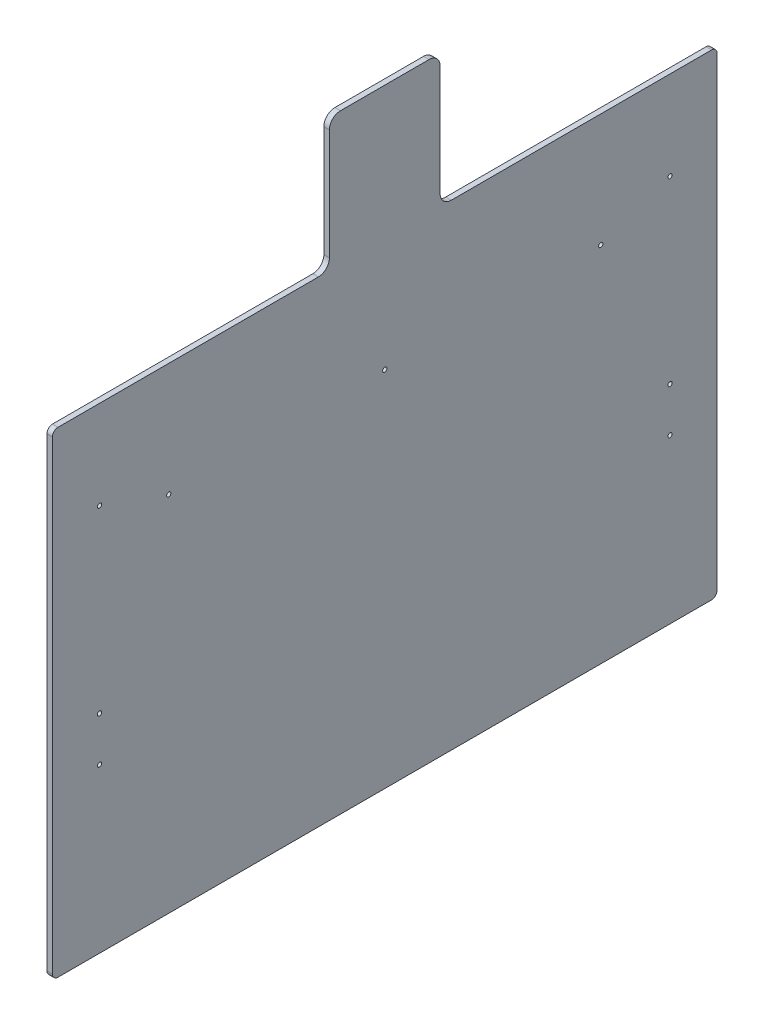
ISO-10303-21;
HEADER;
FILE_DESCRIPTION(('STEP AP214'),'2;1');
FILE_NAME('part.step','',(''),(''),'','','');
FILE_SCHEMA(('AUTOMOTIVE_DESIGN { 1 0 10303 214 1 1 1 1 }'));
ENDSEC;
DATA;
#1=APPLICATION_CONTEXT('core data for automotive mechanical design processes');
#2=APPLICATION_PROTOCOL_DEFINITION('international standard','automotive_design',2000,#1);
#3=PRODUCT_CONTEXT('',#1,'mechanical');
#4=PRODUCT('Part','Part','',(#3));
#5=PRODUCT_RELATED_PRODUCT_CATEGORY('part','',(#4));
#6=PRODUCT_DEFINITION_FORMATION('','',#4);
#7=PRODUCT_DEFINITION_CONTEXT('part definition',#1,'design');
#8=PRODUCT_DEFINITION('design','',#6,#7);
#9=PRODUCT_DEFINITION_SHAPE('','',#8);
#10=(LENGTH_UNIT() NAMED_UNIT(*) SI_UNIT(.MILLI.,.METRE.));
#11=(NAMED_UNIT(*) PLANE_ANGLE_UNIT() SI_UNIT($,.RADIAN.));
#12=(NAMED_UNIT(*) SI_UNIT($,.STERADIAN.) SOLID_ANGLE_UNIT());
#13=UNCERTAINTY_MEASURE_WITH_UNIT(LENGTH_MEASURE(1.E-05),#10,'distance_accuracy_value','');
#14=(GEOMETRIC_REPRESENTATION_CONTEXT(3) GLOBAL_UNCERTAINTY_ASSIGNED_CONTEXT((#13)) GLOBAL_UNIT_ASSIGNED_CONTEXT((#10,
#11,#12)) REPRESENTATION_CONTEXT('',''));
#15=CARTESIAN_POINT('',(0.,0.,0.));
#16=DIRECTION('',(0.,0.,1.));
#17=DIRECTION('',(1.,0.,0.));
#18=AXIS2_PLACEMENT_3D('',#15,#16,#17);
#19=CARTESIAN_POINT('',(6.35,6.35,-6.35));
#20=DIRECTION('',(-1.,0.,0.));
#21=DIRECTION('',(0.,0.,1.));
#22=AXIS2_PLACEMENT_3D('',#19,#20,#21);
#23=PLANE('',#22);
#24=CARTESIAN_POINT('',(6.35,415.925,-133.35));
#25=DIRECTION('',(1.,0.,0.));
#26=DIRECTION('',(0.,0.,-1.));
#27=AXIS2_PLACEMENT_3D('',#24,#25,#26);
#28=CIRCLE('',#27,2.45745000000002);
#29=CARTESIAN_POINT('',(6.35,415.925,-135.80745));
#30=VERTEX_POINT('',#29);
#31=EDGE_CURVE('E358',#30,#30,#28,.T.);
#32=ORIENTED_EDGE('',*,*,#31,.F.);
#33=EDGE_LOOP('',(#32));
#34=FACE_BOUND('',#33,.T.);
#35=CARTESIAN_POINT('',(6.35,415.925,-381.));
#36=DIRECTION('',(1.,0.,0.));
#37=DIRECTION('',(0.,0.,-1.));
#38=AXIS2_PLACEMENT_3D('',#35,#36,#37);
#39=CIRCLE('',#38,2.45744999999995);
#40=CARTESIAN_POINT('',(6.35,415.925,-383.45745));
#41=VERTEX_POINT('',#40);
#42=EDGE_CURVE('E364',#41,#41,#39,.T.);
#43=ORIENTED_EDGE('',*,*,#42,.F.);
#44=EDGE_LOOP('',(#43));
#45=FACE_BOUND('',#44,.T.);
#46=CARTESIAN_POINT('',(6.35,415.925,-628.65));
#47=DIRECTION('',(1.,0.,0.));
#48=DIRECTION('',(0.,0.,-1.));
#49=AXIS2_PLACEMENT_3D('',#46,#47,#48);
#50=CIRCLE('',#49,2.45745);
#51=CARTESIAN_POINT('',(6.35,415.925,-631.10745));
#52=VERTEX_POINT('',#51);
#53=EDGE_CURVE('E372',#52,#52,#50,.T.);
#54=ORIENTED_EDGE('',*,*,#53,.F.);
#55=EDGE_LOOP('',(#54));
#56=FACE_BOUND('',#55,.T.);
#57=CARTESIAN_POINT('',(6.35,6.35,-6.35));
#58=DIRECTION('',(1.,0.,0.));
#59=DIRECTION('',(0.,0.,1.));
#60=AXIS2_PLACEMENT_3D('',#57,#58,#59);
#61=CIRCLE('',#60,6.35);
#62=CARTESIAN_POINT('',(6.35,6.35000000000004,0.));
#63=VERTEX_POINT('',#62);
#64=CARTESIAN_POINT('',(6.35,0.,-6.35000000000004));
#65=VERTEX_POINT('',#64);
#66=EDGE_CURVE('E210',#63,#65,#61,.T.);
#67=ORIENTED_EDGE('',*,*,#66,.T.);
#68=DIRECTION('',(0.,0.,-1.));
#69=VECTOR('',#68,1.);
#70=CARTESIAN_POINT('',(6.35,0.,-6.35000000000004));
#71=LINE('',#70,#69);
#72=CARTESIAN_POINT('',(6.35,0.,-755.65));
#73=VERTEX_POINT('',#72);
#74=EDGE_CURVE('E118',#65,#73,#71,.T.);
#75=ORIENTED_EDGE('',*,*,#74,.T.);
#76=CARTESIAN_POINT('',(6.35,6.35,-755.65));
#77=DIRECTION('',(1.,0.,0.));
#78=DIRECTION('',(0.,0.,-1.));
#79=AXIS2_PLACEMENT_3D('',#76,#77,#78);
#80=CIRCLE('',#79,6.34999999999998);
#81=CARTESIAN_POINT('',(6.35,6.35,-762.));
#82=VERTEX_POINT('',#81);
#83=EDGE_CURVE('E249',#73,#82,#80,.T.);
#84=ORIENTED_EDGE('',*,*,#83,.T.);
#85=DIRECTION('',(0.,1.,0.));
#86=VECTOR('',#85,1.);
#87=CARTESIAN_POINT('',(6.35,6.35000000000004,-762.));
#88=LINE('',#87,#86);
#89=CARTESIAN_POINT('',(6.35,539.75,-762.));
#90=VERTEX_POINT('',#89);
#91=EDGE_CURVE('E268',#82,#90,#88,.T.);
#92=ORIENTED_EDGE('',*,*,#91,.T.);
#93=CARTESIAN_POINT('',(6.35,539.75,-755.65));
#94=DIRECTION('',(1.,0.,0.));
#95=DIRECTION('',(0.,0.,1.));
#96=AXIS2_PLACEMENT_3D('',#93,#94,#95);
#97=CIRCLE('',#96,6.34999999999997);
#98=CARTESIAN_POINT('',(6.35,546.1,-755.65));
#99=VERTEX_POINT('',#98);
#100=EDGE_CURVE('E265',#90,#99,#97,.T.);
#101=ORIENTED_EDGE('',*,*,#100,.T.);
#102=DIRECTION('',(0.,0.,1.));
#103=VECTOR('',#102,1.);
#104=CARTESIAN_POINT('',(6.35,546.1,-457.2));
#105=LINE('',#104,#103);
#106=CARTESIAN_POINT('',(6.35,546.1,-457.2));
#107=VERTEX_POINT('',#106);
#108=EDGE_CURVE('E267',#99,#107,#105,.T.);
#109=ORIENTED_EDGE('',*,*,#108,.T.);
#110=CARTESIAN_POINT('',(6.35,558.8,-457.2));
#111=DIRECTION('',(-1.,0.,0.));
#112=DIRECTION('',(0.,0.,1.));
#113=AXIS2_PLACEMENT_3D('',#110,#111,#112);
#114=CIRCLE('',#113,12.7);
#115=CARTESIAN_POINT('',(6.35,558.8,-444.5));
#116=VERTEX_POINT('',#115);
#117=EDGE_CURVE('E270',#107,#116,#114,.T.);
#118=ORIENTED_EDGE('',*,*,#117,.T.);
#119=DIRECTION('',(0.,1.,0.));
#120=VECTOR('',#119,1.);
#121=CARTESIAN_POINT('',(6.35,558.8,-444.5));
#122=LINE('',#121,#120);
#123=CARTESIAN_POINT('',(6.35,685.8,-444.5));
#124=VERTEX_POINT('',#123);
#125=EDGE_CURVE('E276',#116,#124,#122,.T.);
#126=ORIENTED_EDGE('',*,*,#125,.T.);
#127=CARTESIAN_POINT('',(6.35,685.8,-431.8));
#128=DIRECTION('',(1.,0.,0.));
#129=DIRECTION('',(0.,0.,1.));
#130=AXIS2_PLACEMENT_3D('',#127,#128,#129);
#131=CIRCLE('',#130,12.7);
#132=CARTESIAN_POINT('',(6.35,698.5,-431.8));
#133=VERTEX_POINT('',#132);
#134=EDGE_CURVE('E278',#124,#133,#131,.T.);
#135=ORIENTED_EDGE('',*,*,#134,.T.);
#136=DIRECTION('',(0.,0.,1.));
#137=VECTOR('',#136,1.);
#138=CARTESIAN_POINT('',(6.35,698.5,-330.2));
#139=LINE('',#138,#137);
#140=CARTESIAN_POINT('',(6.35,698.5,-330.2));
#141=VERTEX_POINT('',#140);
#142=EDGE_CURVE('E280',#133,#141,#139,.T.);
#143=ORIENTED_EDGE('',*,*,#142,.T.);
#144=CARTESIAN_POINT('',(6.35,685.8,-330.2));
#145=DIRECTION('',(1.,0.,0.));
#146=DIRECTION('',(0.,0.,1.));
#147=AXIS2_PLACEMENT_3D('',#144,#145,#146);
#148=CIRCLE('',#147,12.7);
#149=CARTESIAN_POINT('',(6.35,685.8,-317.5));
#150=VERTEX_POINT('',#149);
#151=EDGE_CURVE('E282',#141,#150,#148,.T.);
#152=ORIENTED_EDGE('',*,*,#151,.T.);
#153=DIRECTION('',(0.,-1.,0.));
#154=VECTOR('',#153,1.);
#155=CARTESIAN_POINT('',(6.35,558.8,-317.5));
#156=LINE('',#155,#154);
#157=CARTESIAN_POINT('',(6.35,558.8,-317.5));
#158=VERTEX_POINT('',#157);
#159=EDGE_CURVE('E284',#150,#158,#156,.T.);
#160=ORIENTED_EDGE('',*,*,#159,.T.);
#161=CARTESIAN_POINT('',(6.35,558.8,-304.8));
#162=DIRECTION('',(-1.,0.,0.));
#163=DIRECTION('',(0.,0.,-1.));
#164=AXIS2_PLACEMENT_3D('',#161,#162,#163);
#165=CIRCLE('',#164,12.7);
#166=CARTESIAN_POINT('',(6.35,546.1,-304.8));
#167=VERTEX_POINT('',#166);
#168=EDGE_CURVE('E161',#158,#167,#165,.T.);
#169=ORIENTED_EDGE('',*,*,#168,.T.);
#170=DIRECTION('',(0.,0.,1.));
#171=VECTOR('',#170,1.);
#172=CARTESIAN_POINT('',(6.35,546.1,-6.35));
#173=LINE('',#172,#171);
#174=CARTESIAN_POINT('',(6.35,546.1,-6.35));
#175=VERTEX_POINT('',#174);
#176=EDGE_CURVE('E155',#167,#175,#173,.T.);
#177=ORIENTED_EDGE('',*,*,#176,.T.);
#178=CARTESIAN_POINT('',(6.35,539.75,-6.35));
#179=DIRECTION('',(1.,0.,0.));
#180=DIRECTION('',(0.,0.,1.));
#181=AXIS2_PLACEMENT_3D('',#178,#179,#180);
#182=CIRCLE('',#181,6.34999999999998);
#183=CARTESIAN_POINT('',(6.35,539.75,0.));
#184=VERTEX_POINT('',#183);
#185=EDGE_CURVE('E159',#175,#184,#182,.T.);
#186=ORIENTED_EDGE('',*,*,#185,.T.);
#187=DIRECTION('',(0.,-1.,0.));
#188=VECTOR('',#187,1.);
#189=CARTESIAN_POINT('',(6.35,6.35000000000004,0.));
#190=LINE('',#189,#188);
#191=EDGE_CURVE('E51',#184,#63,#190,.T.);
#192=ORIENTED_EDGE('',*,*,#191,.T.);
#193=EDGE_LOOP('',(#67,#75,#84,#92,#101,#109,#118,#126,#135,#143,#152,#160,#169,#177,#186,#192));
#194=FACE_BOUND('',#193,.T.);
#195=CARTESIAN_POINT('',(6.35,444.5,-53.975));
#196=DIRECTION('',(1.,0.,0.));
#197=DIRECTION('',(0.,0.,-1.));
#198=AXIS2_PLACEMENT_3D('',#195,#196,#197);
#199=CIRCLE('',#198,2.45745000000002);
#200=CARTESIAN_POINT('',(6.35,444.5,-56.43245));
#201=VERTEX_POINT('',#200);
#202=EDGE_CURVE('E183',#201,#201,#199,.T.);
#203=ORIENTED_EDGE('',*,*,#202,.F.);
#204=EDGE_LOOP('',(#203));
#205=FACE_BOUND('',#204,.T.);
#206=CARTESIAN_POINT('',(6.35,187.325,-53.975));
#207=DIRECTION('',(1.,0.,0.));
#208=DIRECTION('',(0.,0.,-1.));
#209=AXIS2_PLACEMENT_3D('',#206,#207,#208);
#210=CIRCLE('',#209,2.45745);
#211=CARTESIAN_POINT('',(6.35,187.325,-56.43245));
#212=VERTEX_POINT('',#211);
#213=EDGE_CURVE('E399',#212,#212,#210,.T.);
#214=ORIENTED_EDGE('',*,*,#213,.F.);
#215=EDGE_LOOP('',(#214));
#216=FACE_BOUND('',#215,.T.);
#217=CARTESIAN_POINT('',(6.35,444.5,-708.025));
#218=DIRECTION('',(1.,0.,0.));
#219=DIRECTION('',(0.,0.,-1.));
#220=AXIS2_PLACEMENT_3D('',#217,#218,#219);
#221=CIRCLE('',#220,2.45745);
#222=CARTESIAN_POINT('',(6.35,444.5,-710.48245));
#223=VERTEX_POINT('',#222);
#224=EDGE_CURVE('E393',#223,#223,#221,.T.);
#225=ORIENTED_EDGE('',*,*,#224,.F.);
#226=EDGE_LOOP('',(#225));
#227=FACE_BOUND('',#226,.T.);
#228=CARTESIAN_POINT('',(6.35,238.125,-708.025));
#229=DIRECTION('',(1.,0.,0.));
#230=DIRECTION('',(0.,0.,-1.));
#231=AXIS2_PLACEMENT_3D('',#228,#229,#230);
#232=CIRCLE('',#231,2.45745000000001);
#233=CARTESIAN_POINT('',(6.35,238.125,-710.48245));
#234=VERTEX_POINT('',#233);
#235=EDGE_CURVE('E387',#234,#234,#232,.T.);
#236=ORIENTED_EDGE('',*,*,#235,.F.);
#237=EDGE_LOOP('',(#236));
#238=FACE_BOUND('',#237,.T.);
#239=CARTESIAN_POINT('',(6.35,187.325,-708.025));
#240=DIRECTION('',(1.,0.,0.));
#241=DIRECTION('',(0.,0.,-1.));
#242=AXIS2_PLACEMENT_3D('',#239,#240,#241);
#243=CIRCLE('',#242,2.45745000000001);
#244=CARTESIAN_POINT('',(6.35,187.325,-710.48245));
#245=VERTEX_POINT('',#244);
#246=EDGE_CURVE('E381',#245,#245,#243,.T.);
#247=ORIENTED_EDGE('',*,*,#246,.F.);
#248=EDGE_LOOP('',(#247));
#249=FACE_BOUND('',#248,.T.);
#250=CARTESIAN_POINT('',(6.35,238.125,-53.975));
#251=DIRECTION('',(1.,0.,0.));
#252=DIRECTION('',(0.,0.,-1.));
#253=AXIS2_PLACEMENT_3D('',#250,#251,#252);
#254=CIRCLE('',#253,2.45745);
#255=CARTESIAN_POINT('',(6.35,238.125,-56.43245));
#256=VERTEX_POINT('',#255);
#257=EDGE_CURVE('E375',#256,#256,#254,.T.);
#258=ORIENTED_EDGE('',*,*,#257,.F.);
#259=EDGE_LOOP('',(#258));
#260=FACE_BOUND('',#259,.T.);
#261=ADVANCED_FACE('F34',(#34,#45,#56,#194,#205,#216,#227,#238,#249,#260),#23,.F.);
#262=CARTESIAN_POINT('',(0.,6.35,-6.35));
#263=DIRECTION('',(-1.,0.,0.));
#264=DIRECTION('',(0.,0.,1.));
#265=AXIS2_PLACEMENT_3D('',#262,#263,#264);
#266=PLANE('',#265);
#267=CARTESIAN_POINT('',(0.,415.925,-133.35));
#268=DIRECTION('',(1.,0.,0.));
#269=DIRECTION('',(0.,0.,-1.));
#270=AXIS2_PLACEMENT_3D('',#267,#268,#269);
#271=CIRCLE('',#270,2.45745000000002);
#272=CARTESIAN_POINT('',(0.,415.925,-135.80745));
#273=VERTEX_POINT('',#272);
#274=EDGE_CURVE('E356',#273,#273,#271,.T.);
#275=ORIENTED_EDGE('',*,*,#274,.T.);
#276=EDGE_LOOP('',(#275));
#277=FACE_BOUND('',#276,.T.);
#278=CARTESIAN_POINT('',(0.,415.925,-381.));
#279=DIRECTION('',(1.,0.,0.));
#280=DIRECTION('',(0.,0.,-1.));
#281=AXIS2_PLACEMENT_3D('',#278,#279,#280);
#282=CIRCLE('',#281,2.45744999999995);
#283=CARTESIAN_POINT('',(0.,415.925,-383.45745));
#284=VERTEX_POINT('',#283);
#285=EDGE_CURVE('E359',#284,#284,#282,.T.);
#286=ORIENTED_EDGE('',*,*,#285,.T.);
#287=EDGE_LOOP('',(#286));
#288=FACE_BOUND('',#287,.T.);
#289=CARTESIAN_POINT('',(0.,415.925,-628.65));
#290=DIRECTION('',(1.,0.,0.));
#291=DIRECTION('',(0.,0.,-1.));
#292=AXIS2_PLACEMENT_3D('',#289,#290,#291);
#293=CIRCLE('',#292,2.45745);
#294=CARTESIAN_POINT('',(0.,415.925,-631.10745));
#295=VERTEX_POINT('',#294);
#296=EDGE_CURVE('E369',#295,#295,#293,.T.);
#297=ORIENTED_EDGE('',*,*,#296,.T.);
#298=EDGE_LOOP('',(#297));
#299=FACE_BOUND('',#298,.T.);
#300=CARTESIAN_POINT('',(0.,187.325,-708.025));
#301=DIRECTION('',(1.,0.,0.));
#302=DIRECTION('',(0.,0.,-1.));
#303=AXIS2_PLACEMENT_3D('',#300,#301,#302);
#304=CIRCLE('',#303,2.45745000000001);
#305=CARTESIAN_POINT('',(0.,187.325,-710.48245));
#306=VERTEX_POINT('',#305);
#307=EDGE_CURVE('E378',#306,#306,#304,.T.);
#308=ORIENTED_EDGE('',*,*,#307,.T.);
#309=EDGE_LOOP('',(#308));
#310=FACE_BOUND('',#309,.T.);
#311=CARTESIAN_POINT('',(0.,444.5,-708.025));
#312=DIRECTION('',(1.,0.,0.));
#313=DIRECTION('',(0.,0.,-1.));
#314=AXIS2_PLACEMENT_3D('',#311,#312,#313);
#315=CIRCLE('',#314,2.45745);
#316=CARTESIAN_POINT('',(0.,444.5,-710.48245));
#317=VERTEX_POINT('',#316);
#318=EDGE_CURVE('E390',#317,#317,#315,.T.);
#319=ORIENTED_EDGE('',*,*,#318,.T.);
#320=EDGE_LOOP('',(#319));
#321=FACE_BOUND('',#320,.T.);
#322=CARTESIAN_POINT('',(0.,444.5,-53.975));
#323=DIRECTION('',(1.,0.,0.));
#324=DIRECTION('',(0.,0.,-1.));
#325=AXIS2_PLACEMENT_3D('',#322,#323,#324);
#326=CIRCLE('',#325,2.45745000000002);
#327=CARTESIAN_POINT('',(0.,444.5,-56.43245));
#328=VERTEX_POINT('',#327);
#329=EDGE_CURVE('E402',#328,#328,#326,.T.);
#330=ORIENTED_EDGE('',*,*,#329,.T.);
#331=EDGE_LOOP('',(#330));
#332=FACE_BOUND('',#331,.T.);
#333=CARTESIAN_POINT('',(0.,6.35,-6.35));
#334=DIRECTION('',(1.,0.,0.));
#335=DIRECTION('',(0.,0.,1.));
#336=AXIS2_PLACEMENT_3D('',#333,#334,#335);
#337=CIRCLE('',#336,6.35);
#338=CARTESIAN_POINT('',(0.,6.35000000000004,0.));
#339=VERTEX_POINT('',#338);
#340=CARTESIAN_POINT('',(0.,0.,-6.35000000000004));
#341=VERTEX_POINT('',#340);
#342=EDGE_CURVE('E179',#339,#341,#337,.T.);
#343=ORIENTED_EDGE('',*,*,#342,.F.);
#344=DIRECTION('',(0.,-1.,0.));
#345=VECTOR('',#344,1.);
#346=CARTESIAN_POINT('',(0.,6.35000000000004,0.));
#347=LINE('',#346,#345);
#348=CARTESIAN_POINT('',(0.,539.75,0.));
#349=VERTEX_POINT('',#348);
#350=EDGE_CURVE('E110',#349,#339,#347,.T.);
#351=ORIENTED_EDGE('',*,*,#350,.F.);
#352=CARTESIAN_POINT('',(0.,539.75,-6.35));
#353=DIRECTION('',(1.,0.,0.));
#354=DIRECTION('',(0.,0.,1.));
#355=AXIS2_PLACEMENT_3D('',#352,#353,#354);
#356=CIRCLE('',#355,6.34999999999998);
#357=CARTESIAN_POINT('',(0.,546.1,-6.35));
#358=VERTEX_POINT('',#357);
#359=EDGE_CURVE('E104',#358,#349,#356,.T.);
#360=ORIENTED_EDGE('',*,*,#359,.F.);
#361=DIRECTION('',(0.,0.,1.));
#362=VECTOR('',#361,1.);
#363=CARTESIAN_POINT('',(0.,546.1,-6.35));
#364=LINE('',#363,#362);
#365=CARTESIAN_POINT('',(0.,546.1,-304.8));
#366=VERTEX_POINT('',#365);
#367=EDGE_CURVE('E169',#366,#358,#364,.T.);
#368=ORIENTED_EDGE('',*,*,#367,.F.);
#369=CARTESIAN_POINT('',(0.,558.8,-304.8));
#370=DIRECTION('',(-1.,0.,0.));
#371=DIRECTION('',(0.,0.,-1.));
#372=AXIS2_PLACEMENT_3D('',#369,#370,#371);
#373=CIRCLE('',#372,12.7);
#374=CARTESIAN_POINT('',(0.,558.8,-317.5));
#375=VERTEX_POINT('',#374);
#376=EDGE_CURVE('E205',#375,#366,#373,.T.);
#377=ORIENTED_EDGE('',*,*,#376,.F.);
#378=DIRECTION('',(0.,-1.,0.));
#379=VECTOR('',#378,1.);
#380=CARTESIAN_POINT('',(0.,558.8,-317.5));
#381=LINE('',#380,#379);
#382=CARTESIAN_POINT('',(0.,685.8,-317.5));
#383=VERTEX_POINT('',#382);
#384=EDGE_CURVE('E203',#383,#375,#381,.T.);
#385=ORIENTED_EDGE('',*,*,#384,.F.);
#386=CARTESIAN_POINT('',(0.,685.8,-330.2));
#387=DIRECTION('',(1.,0.,0.));
#388=DIRECTION('',(0.,0.,1.));
#389=AXIS2_PLACEMENT_3D('',#386,#387,#388);
#390=CIRCLE('',#389,12.7);
#391=CARTESIAN_POINT('',(0.,698.5,-330.2));
#392=VERTEX_POINT('',#391);
#393=EDGE_CURVE('E201',#392,#383,#390,.T.);
#394=ORIENTED_EDGE('',*,*,#393,.F.);
#395=DIRECTION('',(0.,0.,1.));
#396=VECTOR('',#395,1.);
#397=CARTESIAN_POINT('',(0.,698.5,-330.2));
#398=LINE('',#397,#396);
#399=CARTESIAN_POINT('',(0.,698.5,-431.8));
#400=VERTEX_POINT('',#399);
#401=EDGE_CURVE('E199',#400,#392,#398,.T.);
#402=ORIENTED_EDGE('',*,*,#401,.F.);
#403=CARTESIAN_POINT('',(0.,685.8,-431.8));
#404=DIRECTION('',(1.,0.,0.));
#405=DIRECTION('',(0.,0.,1.));
#406=AXIS2_PLACEMENT_3D('',#403,#404,#405);
#407=CIRCLE('',#406,12.7);
#408=CARTESIAN_POINT('',(0.,685.8,-444.5));
#409=VERTEX_POINT('',#408);
#410=EDGE_CURVE('E197',#409,#400,#407,.T.);
#411=ORIENTED_EDGE('',*,*,#410,.F.);
#412=DIRECTION('',(0.,1.,0.));
#413=VECTOR('',#412,1.);
#414=CARTESIAN_POINT('',(0.,558.8,-444.5));
#415=LINE('',#414,#413);
#416=CARTESIAN_POINT('',(0.,558.8,-444.5));
#417=VERTEX_POINT('',#416);
#418=EDGE_CURVE('E195',#417,#409,#415,.T.);
#419=ORIENTED_EDGE('',*,*,#418,.F.);
#420=CARTESIAN_POINT('',(0.,558.8,-457.2));
#421=DIRECTION('',(-1.,0.,0.));
#422=DIRECTION('',(0.,0.,1.));
#423=AXIS2_PLACEMENT_3D('',#420,#421,#422);
#424=CIRCLE('',#423,12.7);
#425=CARTESIAN_POINT('',(0.,546.1,-457.2));
#426=VERTEX_POINT('',#425);
#427=EDGE_CURVE('E193',#426,#417,#424,.T.);
#428=ORIENTED_EDGE('',*,*,#427,.F.);
#429=DIRECTION('',(0.,0.,1.));
#430=VECTOR('',#429,1.);
#431=CARTESIAN_POINT('',(0.,546.1,-457.2));
#432=LINE('',#431,#430);
#433=CARTESIAN_POINT('',(0.,546.1,-755.65));
#434=VERTEX_POINT('',#433);
#435=EDGE_CURVE('E191',#434,#426,#432,.T.);
#436=ORIENTED_EDGE('',*,*,#435,.F.);
#437=CARTESIAN_POINT('',(0.,539.75,-755.65));
#438=DIRECTION('',(1.,0.,0.));
#439=DIRECTION('',(0.,0.,1.));
#440=AXIS2_PLACEMENT_3D('',#437,#438,#439);
#441=CIRCLE('',#440,6.34999999999997);
#442=CARTESIAN_POINT('',(0.,539.75,-762.));
#443=VERTEX_POINT('',#442);
#444=EDGE_CURVE('E189',#443,#434,#441,.T.);
#445=ORIENTED_EDGE('',*,*,#444,.F.);
#446=DIRECTION('',(0.,1.,0.));
#447=VECTOR('',#446,1.);
#448=CARTESIAN_POINT('',(0.,6.35000000000004,-762.));
#449=LINE('',#448,#447);
#450=CARTESIAN_POINT('',(0.,6.35,-762.));
#451=VERTEX_POINT('',#450);
#452=EDGE_CURVE('E187',#451,#443,#449,.T.);
#453=ORIENTED_EDGE('',*,*,#452,.F.);
#454=CARTESIAN_POINT('',(0.,6.35,-755.65));
#455=DIRECTION('',(1.,0.,0.));
#456=DIRECTION('',(0.,0.,-1.));
#457=AXIS2_PLACEMENT_3D('',#454,#455,#456);
#458=CIRCLE('',#457,6.34999999999998);
#459=CARTESIAN_POINT('',(0.,0.,-755.65));
#460=VERTEX_POINT('',#459);
#461=EDGE_CURVE('E185',#460,#451,#458,.T.);
#462=ORIENTED_EDGE('',*,*,#461,.F.);
#463=DIRECTION('',(0.,0.,-1.));
#464=VECTOR('',#463,1.);
#465=CARTESIAN_POINT('',(0.,0.,-6.35000000000004));
#466=LINE('',#465,#464);
#467=EDGE_CURVE('E182',#341,#460,#466,.T.);
#468=ORIENTED_EDGE('',*,*,#467,.F.);
#469=EDGE_LOOP('',(#343,#351,#360,#368,#377,#385,#394,#402,#411,#419,#428,#436,#445,#453,#462,#468));
#470=FACE_BOUND('',#469,.T.);
#471=CARTESIAN_POINT('',(0.,187.325,-53.975));
#472=DIRECTION('',(1.,0.,0.));
#473=DIRECTION('',(0.,0.,-1.));
#474=AXIS2_PLACEMENT_3D('',#471,#472,#473);
#475=CIRCLE('',#474,2.45745);
#476=CARTESIAN_POINT('',(0.,187.325,-56.43245));
#477=VERTEX_POINT('',#476);
#478=EDGE_CURVE('E396',#477,#477,#475,.T.);
#479=ORIENTED_EDGE('',*,*,#478,.T.);
#480=EDGE_LOOP('',(#479));
#481=FACE_BOUND('',#480,.T.);
#482=CARTESIAN_POINT('',(0.,238.125,-708.025));
#483=DIRECTION('',(1.,0.,0.));
#484=DIRECTION('',(0.,0.,-1.));
#485=AXIS2_PLACEMENT_3D('',#482,#483,#484);
#486=CIRCLE('',#485,2.45745000000001);
#487=CARTESIAN_POINT('',(0.,238.125,-710.48245));
#488=VERTEX_POINT('',#487);
#489=EDGE_CURVE('E384',#488,#488,#486,.T.);
#490=ORIENTED_EDGE('',*,*,#489,.T.);
#491=EDGE_LOOP('',(#490));
#492=FACE_BOUND('',#491,.T.);
#493=CARTESIAN_POINT('',(0.,238.125,-53.975));
#494=DIRECTION('',(1.,0.,0.));
#495=DIRECTION('',(0.,0.,-1.));
#496=AXIS2_PLACEMENT_3D('',#493,#494,#495);
#497=CIRCLE('',#496,2.45745);
#498=CARTESIAN_POINT('',(0.,238.125,-56.43245));
#499=VERTEX_POINT('',#498);
#500=EDGE_CURVE('E361',#499,#499,#497,.T.);
#501=ORIENTED_EDGE('',*,*,#500,.T.);
#502=EDGE_LOOP('',(#501));
#503=FACE_BOUND('',#502,.T.);
#504=ADVANCED_FACE('F253',(#277,#288,#299,#310,#321,#332,#470,#481,#492,#503),#266,.T.);
#505=CARTESIAN_POINT('',(6.35,6.35,-6.35));
#506=DIRECTION('',(-1.,0.,0.));
#507=DIRECTION('',(0.,0.,1.));
#508=AXIS2_PLACEMENT_3D('',#505,#506,#507);
#509=CYLINDRICAL_SURFACE('',#508,6.35);
#510=ORIENTED_EDGE('',*,*,#342,.T.);
#511=DIRECTION('',(-1.,0.,0.));
#512=VECTOR('',#511,1.);
#513=CARTESIAN_POINT('',(6.35,0.,-6.35000000000004));
#514=LINE('',#513,#512);
#515=EDGE_CURVE('E11',#65,#341,#514,.T.);
#516=ORIENTED_EDGE('',*,*,#515,.F.);
#517=ORIENTED_EDGE('',*,*,#66,.F.);
#518=DIRECTION('',(-1.,0.,0.));
#519=VECTOR('',#518,1.);
#520=CARTESIAN_POINT('',(6.35,6.35000000000004,0.));
#521=LINE('',#520,#519);
#522=EDGE_CURVE('E175',#63,#339,#521,.T.);
#523=ORIENTED_EDGE('',*,*,#522,.T.);
#524=EDGE_LOOP('',(#510,#516,#517,#523));
#525=FACE_BOUND('',#524,.T.);
#526=ADVANCED_FACE('F36',(#525),#509,.T.);
#527=CARTESIAN_POINT('',(6.35,0.,-6.35000000000004));
#528=DIRECTION('',(0.,1.,0.));
#529=DIRECTION('',(0.,0.,1.));
#530=AXIS2_PLACEMENT_3D('',#527,#528,#529);
#531=PLANE('',#530);
#532=ORIENTED_EDGE('',*,*,#467,.T.);
#533=DIRECTION('',(-1.,0.,0.));
#534=VECTOR('',#533,1.);
#535=CARTESIAN_POINT('',(6.35,0.,-755.65));
#536=LINE('',#535,#534);
#537=EDGE_CURVE('E43',#73,#460,#536,.T.);
#538=ORIENTED_EDGE('',*,*,#537,.F.);
#539=ORIENTED_EDGE('',*,*,#74,.F.);
#540=ORIENTED_EDGE('',*,*,#515,.T.);
#541=EDGE_LOOP('',(#532,#538,#539,#540));
#542=FACE_BOUND('',#541,.T.);
#543=ADVANCED_FACE('F599',(#542),#531,.F.);
#544=CARTESIAN_POINT('',(6.35,6.35,-755.65));
#545=DIRECTION('',(-1.,0.,0.));
#546=DIRECTION('',(0.,0.,1.));
#547=AXIS2_PLACEMENT_3D('',#544,#545,#546);
#548=CYLINDRICAL_SURFACE('',#547,6.34999999999998);
#549=ORIENTED_EDGE('',*,*,#461,.T.);
#550=DIRECTION('',(-1.,0.,0.));
#551=VECTOR('',#550,1.);
#552=CARTESIAN_POINT('',(6.35,6.35,-762.));
#553=LINE('',#552,#551);
#554=EDGE_CURVE('E241',#82,#451,#553,.T.);
#555=ORIENTED_EDGE('',*,*,#554,.F.);
#556=ORIENTED_EDGE('',*,*,#83,.F.);
#557=ORIENTED_EDGE('',*,*,#537,.T.);
#558=EDGE_LOOP('',(#549,#555,#556,#557));
#559=FACE_BOUND('',#558,.T.);
#560=ADVANCED_FACE('F247',(#559),#548,.T.);
#561=CARTESIAN_POINT('',(6.35,6.35000000000004,-762.));
#562=DIRECTION('',(0.,0.,1.));
#563=DIRECTION('',(1.,0.,0.));
#564=AXIS2_PLACEMENT_3D('',#561,#562,#563);
#565=PLANE('',#564);
#566=ORIENTED_EDGE('',*,*,#452,.T.);
#567=DIRECTION('',(-1.,0.,0.));
#568=VECTOR('',#567,1.);
#569=CARTESIAN_POINT('',(6.35,539.75,-762.));
#570=LINE('',#569,#568);
#571=EDGE_CURVE('E238',#90,#443,#570,.T.);
#572=ORIENTED_EDGE('',*,*,#571,.F.);
#573=ORIENTED_EDGE('',*,*,#91,.F.);
#574=ORIENTED_EDGE('',*,*,#554,.T.);
#575=EDGE_LOOP('',(#566,#572,#573,#574));
#576=FACE_BOUND('',#575,.T.);
#577=ADVANCED_FACE('F259',(#576),#565,.F.);
#578=CARTESIAN_POINT('',(6.35,539.75,-755.65));
#579=DIRECTION('',(-1.,0.,0.));
#580=DIRECTION('',(0.,0.,1.));
#581=AXIS2_PLACEMENT_3D('',#578,#579,#580);
#582=CYLINDRICAL_SURFACE('',#581,6.34999999999997);
#583=ORIENTED_EDGE('',*,*,#444,.T.);
#584=DIRECTION('',(-1.,0.,0.));
#585=VECTOR('',#584,1.);
#586=CARTESIAN_POINT('',(6.35,546.1,-755.65));
#587=LINE('',#586,#585);
#588=EDGE_CURVE('E235',#99,#434,#587,.T.);
#589=ORIENTED_EDGE('',*,*,#588,.F.);
#590=ORIENTED_EDGE('',*,*,#100,.F.);
#591=ORIENTED_EDGE('',*,*,#571,.T.);
#592=EDGE_LOOP('',(#583,#589,#590,#591));
#593=FACE_BOUND('',#592,.T.);
#594=ADVANCED_FACE('F263',(#593),#582,.T.);
#595=CARTESIAN_POINT('',(6.35,546.1,-457.2));
#596=DIRECTION('',(0.,-1.,0.));
#597=DIRECTION('',(0.,0.,-1.));
#598=AXIS2_PLACEMENT_3D('',#595,#596,#597);
#599=PLANE('',#598);
#600=ORIENTED_EDGE('',*,*,#435,.T.);
#601=DIRECTION('',(-1.,0.,0.));
#602=VECTOR('',#601,1.);
#603=CARTESIAN_POINT('',(6.35,546.1,-457.2));
#604=LINE('',#603,#602);
#605=EDGE_CURVE('E232',#107,#426,#604,.T.);
#606=ORIENTED_EDGE('',*,*,#605,.F.);
#607=ORIENTED_EDGE('',*,*,#108,.F.);
#608=ORIENTED_EDGE('',*,*,#588,.T.);
#609=EDGE_LOOP('',(#600,#606,#607,#608));
#610=FACE_BOUND('',#609,.T.);
#611=ADVANCED_FACE('F564',(#610),#599,.F.);
#612=CARTESIAN_POINT('',(6.35,558.8,-457.2));
#613=DIRECTION('',(-1.,0.,0.));
#614=DIRECTION('',(0.,0.,1.));
#615=AXIS2_PLACEMENT_3D('',#612,#613,#614);
#616=CYLINDRICAL_SURFACE('',#615,12.7);
#617=ORIENTED_EDGE('',*,*,#427,.T.);
#618=DIRECTION('',(-1.,0.,0.));
#619=VECTOR('',#618,1.);
#620=CARTESIAN_POINT('',(6.35,558.8,-444.5));
#621=LINE('',#620,#619);
#622=EDGE_CURVE('E229',#116,#417,#621,.T.);
#623=ORIENTED_EDGE('',*,*,#622,.F.);
#624=ORIENTED_EDGE('',*,*,#117,.F.);
#625=ORIENTED_EDGE('',*,*,#605,.T.);
#626=EDGE_LOOP('',(#617,#623,#624,#625));
#627=FACE_BOUND('',#626,.T.);
#628=ADVANCED_FACE('F554',(#627),#616,.F.);
#629=CARTESIAN_POINT('',(6.35,558.8,-444.5));
#630=DIRECTION('',(0.,0.,1.));
#631=DIRECTION('',(1.,0.,0.));
#632=AXIS2_PLACEMENT_3D('',#629,#630,#631);
#633=PLANE('',#632);
#634=ORIENTED_EDGE('',*,*,#418,.T.);
#635=DIRECTION('',(-1.,0.,0.));
#636=VECTOR('',#635,1.);
#637=CARTESIAN_POINT('',(6.35,685.8,-444.5));
#638=LINE('',#637,#636);
#639=EDGE_CURVE('E226',#124,#409,#638,.T.);
#640=ORIENTED_EDGE('',*,*,#639,.F.);
#641=ORIENTED_EDGE('',*,*,#125,.F.);
#642=ORIENTED_EDGE('',*,*,#622,.T.);
#643=EDGE_LOOP('',(#634,#640,#641,#642));
#644=FACE_BOUND('',#643,.T.);
#645=ADVANCED_FACE('F544',(#644),#633,.F.);
#646=CARTESIAN_POINT('',(6.35,685.8,-431.8));
#647=DIRECTION('',(-1.,0.,0.));
#648=DIRECTION('',(0.,0.,1.));
#649=AXIS2_PLACEMENT_3D('',#646,#647,#648);
#650=CYLINDRICAL_SURFACE('',#649,12.7);
#651=ORIENTED_EDGE('',*,*,#410,.T.);
#652=DIRECTION('',(-1.,0.,0.));
#653=VECTOR('',#652,1.);
#654=CARTESIAN_POINT('',(6.35,698.5,-431.8));
#655=LINE('',#654,#653);
#656=EDGE_CURVE('E223',#133,#400,#655,.T.);
#657=ORIENTED_EDGE('',*,*,#656,.F.);
#658=ORIENTED_EDGE('',*,*,#134,.F.);
#659=ORIENTED_EDGE('',*,*,#639,.T.);
#660=EDGE_LOOP('',(#651,#657,#658,#659));
#661=FACE_BOUND('',#660,.T.);
#662=ADVANCED_FACE('F534',(#661),#650,.T.);
#663=CARTESIAN_POINT('',(6.35,698.5,-330.2));
#664=DIRECTION('',(0.,-1.,0.));
#665=DIRECTION('',(0.,0.,-1.));
#666=AXIS2_PLACEMENT_3D('',#663,#664,#665);
#667=PLANE('',#666);
#668=ORIENTED_EDGE('',*,*,#401,.T.);
#669=DIRECTION('',(-1.,0.,0.));
#670=VECTOR('',#669,1.);
#671=CARTESIAN_POINT('',(6.35,698.5,-330.2));
#672=LINE('',#671,#670);
#673=EDGE_CURVE('E220',#141,#392,#672,.T.);
#674=ORIENTED_EDGE('',*,*,#673,.F.);
#675=ORIENTED_EDGE('',*,*,#142,.F.);
#676=ORIENTED_EDGE('',*,*,#656,.T.);
#677=EDGE_LOOP('',(#668,#674,#675,#676));
#678=FACE_BOUND('',#677,.T.);
#679=ADVANCED_FACE('F524',(#678),#667,.F.);
#680=CARTESIAN_POINT('',(6.35,685.8,-330.2));
#681=DIRECTION('',(-1.,0.,0.));
#682=DIRECTION('',(0.,0.,1.));
#683=AXIS2_PLACEMENT_3D('',#680,#681,#682);
#684=CYLINDRICAL_SURFACE('',#683,12.7);
#685=ORIENTED_EDGE('',*,*,#393,.T.);
#686=DIRECTION('',(-1.,0.,0.));
#687=VECTOR('',#686,1.);
#688=CARTESIAN_POINT('',(6.35,685.8,-317.5));
#689=LINE('',#688,#687);
#690=EDGE_CURVE('E217',#150,#383,#689,.T.);
#691=ORIENTED_EDGE('',*,*,#690,.F.);
#692=ORIENTED_EDGE('',*,*,#151,.F.);
#693=ORIENTED_EDGE('',*,*,#673,.T.);
#694=EDGE_LOOP('',(#685,#691,#692,#693));
#695=FACE_BOUND('',#694,.T.);
#696=ADVANCED_FACE('F515',(#695),#684,.T.);
#697=CARTESIAN_POINT('',(6.35,558.8,-317.5));
#698=DIRECTION('',(0.,0.,-1.));
#699=DIRECTION('',(-1.,0.,0.));
#700=AXIS2_PLACEMENT_3D('',#697,#698,#699);
#701=PLANE('',#700);
#702=ORIENTED_EDGE('',*,*,#384,.T.);
#703=DIRECTION('',(-1.,0.,0.));
#704=VECTOR('',#703,1.);
#705=CARTESIAN_POINT('',(6.35,558.8,-317.5));
#706=LINE('',#705,#704);
#707=EDGE_CURVE('E214',#158,#375,#706,.T.);
#708=ORIENTED_EDGE('',*,*,#707,.F.);
#709=ORIENTED_EDGE('',*,*,#159,.F.);
#710=ORIENTED_EDGE('',*,*,#690,.T.);
#711=EDGE_LOOP('',(#702,#708,#709,#710));
#712=FACE_BOUND('',#711,.T.);
#713=ADVANCED_FACE('F290',(#712),#701,.F.);
#714=CARTESIAN_POINT('',(6.35,558.8,-304.8));
#715=DIRECTION('',(-1.,0.,0.));
#716=DIRECTION('',(0.,0.,1.));
#717=AXIS2_PLACEMENT_3D('',#714,#715,#716);
#718=CYLINDRICAL_SURFACE('',#717,12.7);
#719=ORIENTED_EDGE('',*,*,#376,.T.);
#720=DIRECTION('',(-1.,0.,0.));
#721=VECTOR('',#720,1.);
#722=CARTESIAN_POINT('',(6.35,546.1,-304.8));
#723=LINE('',#722,#721);
#724=EDGE_CURVE('E170',#167,#366,#723,.T.);
#725=ORIENTED_EDGE('',*,*,#724,.F.);
#726=ORIENTED_EDGE('',*,*,#168,.F.);
#727=ORIENTED_EDGE('',*,*,#707,.T.);
#728=EDGE_LOOP('',(#719,#725,#726,#727));
#729=FACE_BOUND('',#728,.T.);
#730=ADVANCED_FACE('F294',(#729),#718,.F.);
#731=CARTESIAN_POINT('',(6.35,546.1,-6.35));
#732=DIRECTION('',(0.,-1.,0.));
#733=DIRECTION('',(0.,0.,-1.));
#734=AXIS2_PLACEMENT_3D('',#731,#732,#733);
#735=PLANE('',#734);
#736=ORIENTED_EDGE('',*,*,#367,.T.);
#737=DIRECTION('',(-1.,0.,0.));
#738=VECTOR('',#737,1.);
#739=CARTESIAN_POINT('',(6.35,546.1,-6.35));
#740=LINE('',#739,#738);
#741=EDGE_CURVE('E166',#175,#358,#740,.T.);
#742=ORIENTED_EDGE('',*,*,#741,.F.);
#743=ORIENTED_EDGE('',*,*,#176,.F.);
#744=ORIENTED_EDGE('',*,*,#724,.T.);
#745=EDGE_LOOP('',(#736,#742,#743,#744));
#746=FACE_BOUND('',#745,.T.);
#747=ADVANCED_FACE('F167',(#746),#735,.F.);
#748=CARTESIAN_POINT('',(6.35,539.75,-6.35));
#749=DIRECTION('',(-1.,0.,0.));
#750=DIRECTION('',(0.,0.,1.));
#751=AXIS2_PLACEMENT_3D('',#748,#749,#750);
#752=CYLINDRICAL_SURFACE('',#751,6.34999999999998);
#753=ORIENTED_EDGE('',*,*,#359,.T.);
#754=DIRECTION('',(-1.,0.,0.));
#755=VECTOR('',#754,1.);
#756=CARTESIAN_POINT('',(6.35,539.75,0.));
#757=LINE('',#756,#755);
#758=EDGE_CURVE('E171',#184,#349,#757,.T.);
#759=ORIENTED_EDGE('',*,*,#758,.F.);
#760=ORIENTED_EDGE('',*,*,#185,.F.);
#761=ORIENTED_EDGE('',*,*,#741,.T.);
#762=EDGE_LOOP('',(#753,#759,#760,#761));
#763=FACE_BOUND('',#762,.T.);
#764=ADVANCED_FACE('F173',(#763),#752,.T.);
#765=CARTESIAN_POINT('',(6.35,6.35000000000004,0.));
#766=DIRECTION('',(0.,0.,-1.));
#767=DIRECTION('',(-1.,0.,0.));
#768=AXIS2_PLACEMENT_3D('',#765,#766,#767);
#769=PLANE('',#768);
#770=ORIENTED_EDGE('',*,*,#350,.T.);
#771=ORIENTED_EDGE('',*,*,#522,.F.);
#772=ORIENTED_EDGE('',*,*,#191,.F.);
#773=ORIENTED_EDGE('',*,*,#758,.T.);
#774=EDGE_LOOP('',(#770,#771,#772,#773));
#775=FACE_BOUND('',#774,.T.);
#776=ADVANCED_FACE('F298',(#775),#769,.F.);
#777=CARTESIAN_POINT('',(6.35,444.5,-53.975));
#778=DIRECTION('',(-1.,0.,0.));
#779=DIRECTION('',(0.,0.,1.));
#780=AXIS2_PLACEMENT_3D('',#777,#778,#779);
#781=CYLINDRICAL_SURFACE('',#780,2.45745000000002);
#782=ORIENTED_EDGE('',*,*,#202,.T.);
#783=EDGE_LOOP('',(#782));
#784=FACE_BOUND('',#783,.T.);
#785=ORIENTED_EDGE('',*,*,#329,.F.);
#786=EDGE_LOOP('',(#785));
#787=FACE_BOUND('',#786,.T.);
#788=ADVANCED_FACE('F300',(#784,#787),#781,.F.);
#789=CARTESIAN_POINT('',(6.35,187.325,-53.975));
#790=DIRECTION('',(-1.,0.,0.));
#791=DIRECTION('',(0.,0.,1.));
#792=AXIS2_PLACEMENT_3D('',#789,#790,#791);
#793=CYLINDRICAL_SURFACE('',#792,2.45745);
#794=ORIENTED_EDGE('',*,*,#213,.T.);
#795=EDGE_LOOP('',(#794));
#796=FACE_BOUND('',#795,.T.);
#797=ORIENTED_EDGE('',*,*,#478,.F.);
#798=EDGE_LOOP('',(#797));
#799=FACE_BOUND('',#798,.T.);
#800=ADVANCED_FACE('F306',(#796,#799),#793,.F.);
#801=CARTESIAN_POINT('',(6.35,444.5,-708.025));
#802=DIRECTION('',(-1.,0.,0.));
#803=DIRECTION('',(0.,0.,1.));
#804=AXIS2_PLACEMENT_3D('',#801,#802,#803);
#805=CYLINDRICAL_SURFACE('',#804,2.45745);
#806=ORIENTED_EDGE('',*,*,#224,.T.);
#807=EDGE_LOOP('',(#806));
#808=FACE_BOUND('',#807,.T.);
#809=ORIENTED_EDGE('',*,*,#318,.F.);
#810=EDGE_LOOP('',(#809));
#811=FACE_BOUND('',#810,.T.);
#812=ADVANCED_FACE('F323',(#808,#811),#805,.F.);
#813=CARTESIAN_POINT('',(6.35,238.125,-708.025));
#814=DIRECTION('',(-1.,0.,0.));
#815=DIRECTION('',(0.,0.,1.));
#816=AXIS2_PLACEMENT_3D('',#813,#814,#815);
#817=CYLINDRICAL_SURFACE('',#816,2.45745000000001);
#818=ORIENTED_EDGE('',*,*,#235,.T.);
#819=EDGE_LOOP('',(#818));
#820=FACE_BOUND('',#819,.T.);
#821=ORIENTED_EDGE('',*,*,#489,.F.);
#822=EDGE_LOOP('',(#821));
#823=FACE_BOUND('',#822,.T.);
#824=ADVANCED_FACE('F327',(#820,#823),#817,.F.);
#825=CARTESIAN_POINT('',(6.35,187.325,-708.025));
#826=DIRECTION('',(-1.,0.,0.));
#827=DIRECTION('',(0.,0.,1.));
#828=AXIS2_PLACEMENT_3D('',#825,#826,#827);
#829=CYLINDRICAL_SURFACE('',#828,2.45745000000001);
#830=ORIENTED_EDGE('',*,*,#246,.T.);
#831=EDGE_LOOP('',(#830));
#832=FACE_BOUND('',#831,.T.);
#833=ORIENTED_EDGE('',*,*,#307,.F.);
#834=EDGE_LOOP('',(#833));
#835=FACE_BOUND('',#834,.T.);
#836=ADVANCED_FACE('F331',(#832,#835),#829,.F.);
#837=CARTESIAN_POINT('',(6.35,238.125,-53.975));
#838=DIRECTION('',(-1.,0.,0.));
#839=DIRECTION('',(0.,0.,1.));
#840=AXIS2_PLACEMENT_3D('',#837,#838,#839);
#841=CYLINDRICAL_SURFACE('',#840,2.45745);
#842=ORIENTED_EDGE('',*,*,#257,.T.);
#843=EDGE_LOOP('',(#842));
#844=FACE_BOUND('',#843,.T.);
#845=ORIENTED_EDGE('',*,*,#500,.F.);
#846=EDGE_LOOP('',(#845));
#847=FACE_BOUND('',#846,.T.);
#848=ADVANCED_FACE('F335',(#844,#847),#841,.F.);
#849=CARTESIAN_POINT('',(0.,415.925,-628.65));
#850=DIRECTION('',(1.,0.,0.));
#851=DIRECTION('',(0.,0.,-1.));
#852=AXIS2_PLACEMENT_3D('',#849,#850,#851);
#853=CYLINDRICAL_SURFACE('',#852,2.45745);
#854=ORIENTED_EDGE('',*,*,#296,.F.);
#855=EDGE_LOOP('',(#854));
#856=FACE_BOUND('',#855,.T.);
#857=ORIENTED_EDGE('',*,*,#53,.T.);
#858=EDGE_LOOP('',(#857));
#859=FACE_BOUND('',#858,.T.);
#860=ADVANCED_FACE('F339',(#856,#859),#853,.F.);
#861=CARTESIAN_POINT('',(0.,415.925,-381.));
#862=DIRECTION('',(1.,0.,0.));
#863=DIRECTION('',(0.,0.,-1.));
#864=AXIS2_PLACEMENT_3D('',#861,#862,#863);
#865=CYLINDRICAL_SURFACE('',#864,2.45744999999995);
#866=ORIENTED_EDGE('',*,*,#285,.F.);
#867=EDGE_LOOP('',(#866));
#868=FACE_BOUND('',#867,.T.);
#869=ORIENTED_EDGE('',*,*,#42,.T.);
#870=EDGE_LOOP('',(#869));
#871=FACE_BOUND('',#870,.T.);
#872=ADVANCED_FACE('F343',(#868,#871),#865,.F.);
#873=CARTESIAN_POINT('',(0.,415.925,-133.35));
#874=DIRECTION('',(1.,0.,0.));
#875=DIRECTION('',(0.,0.,-1.));
#876=AXIS2_PLACEMENT_3D('',#873,#874,#875);
#877=CYLINDRICAL_SURFACE('',#876,2.45745000000002);
#878=ORIENTED_EDGE('',*,*,#274,.F.);
#879=EDGE_LOOP('',(#878));
#880=FACE_BOUND('',#879,.T.);
#881=ORIENTED_EDGE('',*,*,#31,.T.);
#882=EDGE_LOOP('',(#881));
#883=FACE_BOUND('',#882,.T.);
#884=ADVANCED_FACE('F347',(#880,#883),#877,.F.);
#885=CLOSED_SHELL('',(#261,#504,#526,#543,#560,#577,#594,#611,#628,#645,#662,#679,#696,#713,
#730,#747,#764,#776,#788,#800,#812,#824,#836,#848,#860,#872,#884));
#886=MANIFOLD_SOLID_BREP('B2',#885);
#887=ADVANCED_BREP_SHAPE_REPRESENTATION('',(#18,#886),#14);
#888=SHAPE_DEFINITION_REPRESENTATION(#9,#887);
ENDSEC;
END-ISO-10303-21;
